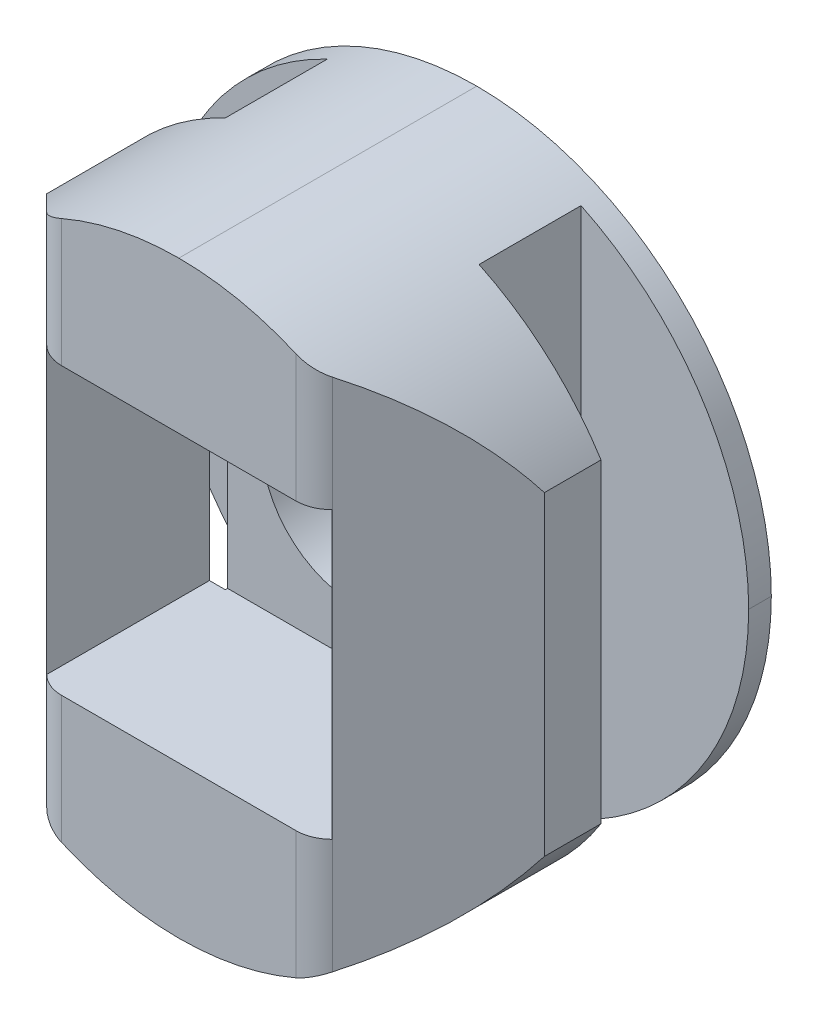
ISO-10303-21;
HEADER;
FILE_DESCRIPTION(('STEP AP214'),'2;1');
FILE_NAME('part.step','',(''),(''),'','','');
FILE_SCHEMA(('AUTOMOTIVE_DESIGN { 1 0 10303 214 1 1 1 1 }'));
ENDSEC;
DATA;
#1=APPLICATION_CONTEXT('core data for automotive mechanical design processes');
#2=APPLICATION_PROTOCOL_DEFINITION('international standard','automotive_design',2000,#1);
#3=PRODUCT_CONTEXT('',#1,'mechanical');
#4=PRODUCT('Part','Part','',(#3));
#5=PRODUCT_RELATED_PRODUCT_CATEGORY('part','',(#4));
#6=PRODUCT_DEFINITION_FORMATION('','',#4);
#7=PRODUCT_DEFINITION_CONTEXT('part definition',#1,'design');
#8=PRODUCT_DEFINITION('design','',#6,#7);
#9=PRODUCT_DEFINITION_SHAPE('','',#8);
#10=(LENGTH_UNIT() NAMED_UNIT(*) SI_UNIT(.MILLI.,.METRE.));
#11=(NAMED_UNIT(*) PLANE_ANGLE_UNIT() SI_UNIT($,.RADIAN.));
#12=(NAMED_UNIT(*) SI_UNIT($,.STERADIAN.) SOLID_ANGLE_UNIT());
#13=UNCERTAINTY_MEASURE_WITH_UNIT(LENGTH_MEASURE(1.E-05),#10,'distance_accuracy_value','');
#14=(GEOMETRIC_REPRESENTATION_CONTEXT(3) GLOBAL_UNCERTAINTY_ASSIGNED_CONTEXT((#13)) GLOBAL_UNIT_ASSIGNED_CONTEXT((#10,
#11,#12)) REPRESENTATION_CONTEXT('',''));
#15=CARTESIAN_POINT('',(0.,0.,0.));
#16=DIRECTION('',(0.,0.,1.));
#17=DIRECTION('',(1.,0.,0.));
#18=AXIS2_PLACEMENT_3D('',#15,#16,#17);
#19=CARTESIAN_POINT('',(2.5857864376269,6.5,-4.075));
#20=DIRECTION('',(0.,0.,-1.));
#21=DIRECTION('',(-1.,0.,0.));
#22=AXIS2_PLACEMENT_3D('',#19,#20,#21);
#23=PLANE('',#22);
#24=DIRECTION('',(0.,-1.,0.));
#25=VECTOR('',#24,1.);
#26=CARTESIAN_POINT('',(-2.58578643762691,6.5,-4.075));
#27=LINE('',#26,#25);
#28=CARTESIAN_POINT('',(-2.58578643762691,5.96353154590338,-4.075));
#29=VERTEX_POINT('',#28);
#30=CARTESIAN_POINT('',(-2.58578643762691,3.15,-4.075));
#31=VERTEX_POINT('',#30);
#32=EDGE_CURVE('E276',#29,#31,#27,.T.);
#33=ORIENTED_EDGE('',*,*,#32,.T.);
#34=DIRECTION('',(-1.,0.,0.));
#35=VECTOR('',#34,1.);
#36=CARTESIAN_POINT('',(-3.15,3.15,-4.075));
#37=LINE('',#36,#35);
#38=CARTESIAN_POINT('',(2.5857864376269,3.15,-4.075));
#39=VERTEX_POINT('',#38);
#40=EDGE_CURVE('E394',#39,#31,#37,.T.);
#41=ORIENTED_EDGE('',*,*,#40,.F.);
#42=DIRECTION('',(0.,-1.,0.));
#43=VECTOR('',#42,1.);
#44=CARTESIAN_POINT('',(2.5857864376269,6.5,-4.075));
#45=LINE('',#44,#43);
#46=CARTESIAN_POINT('',(2.5857864376269,5.96353154590338,-4.075));
#47=VERTEX_POINT('',#46);
#48=EDGE_CURVE('E272',#47,#39,#45,.T.);
#49=ORIENTED_EDGE('',*,*,#48,.F.);
#50=CARTESIAN_POINT('',(0.,0.,-4.075));
#51=DIRECTION('',(0.,0.,-1.));
#52=DIRECTION('',(-1.,0.,0.));
#53=AXIS2_PLACEMENT_3D('',#50,#51,#52);
#54=CIRCLE('',#53,6.5);
#55=CARTESIAN_POINT('',(0.,6.5,-4.075));
#56=VERTEX_POINT('',#55);
#57=EDGE_CURVE('E307',#47,#56,#54,.F.);
#58=ORIENTED_EDGE('',*,*,#57,.T.);
#59=CARTESIAN_POINT('',(0.,0.,-4.075));
#60=DIRECTION('',(0.,0.,-1.));
#61=DIRECTION('',(-1.,0.,0.));
#62=AXIS2_PLACEMENT_3D('',#59,#60,#61);
#63=CIRCLE('',#62,6.5);
#64=EDGE_CURVE('E305',#56,#29,#63,.F.);
#65=ORIENTED_EDGE('',*,*,#64,.T.);
#66=EDGE_LOOP('',(#33,#41,#49,#58,#65));
#67=FACE_BOUND('',#66,.T.);
#68=ADVANCED_FACE('F41',(#67),#23,.F.);
#69=CARTESIAN_POINT('',(0.,0.,-4.075));
#70=DIRECTION('',(0.,0.,-1.));
#71=DIRECTION('',(-1.,0.,0.));
#72=AXIS2_PLACEMENT_3D('',#69,#70,#71);
#73=CYLINDRICAL_SURFACE('',#72,2.05);
#74=CARTESIAN_POINT('',(0.,0.,-7.95));
#75=DIRECTION('',(0.,0.,-1.));
#76=DIRECTION('',(-1.,0.,0.));
#77=AXIS2_PLACEMENT_3D('',#74,#75,#76);
#78=CIRCLE('',#77,2.05);
#79=CARTESIAN_POINT('',(-2.05,0.,-7.95));
#80=VERTEX_POINT('',#79);
#81=EDGE_CURVE('E243',#80,#80,#78,.F.);
#82=ORIENTED_EDGE('',*,*,#81,.T.);
#83=EDGE_LOOP('',(#82));
#84=FACE_BOUND('',#83,.T.);
#85=CARTESIAN_POINT('',(0.,0.,-10.45));
#86=DIRECTION('',(0.,0.,-1.));
#87=DIRECTION('',(-1.,0.,0.));
#88=AXIS2_PLACEMENT_3D('',#85,#86,#87);
#89=CIRCLE('',#88,2.05);
#90=CARTESIAN_POINT('',(-2.05,0.,-10.45));
#91=VERTEX_POINT('',#90);
#92=EDGE_CURVE('E250',#91,#91,#89,.F.);
#93=ORIENTED_EDGE('',*,*,#92,.F.);
#94=EDGE_LOOP('',(#93));
#95=FACE_BOUND('',#94,.T.);
#96=ADVANCED_FACE('F382',(#84,#95),#73,.F.);
#97=CARTESIAN_POINT('',(-6.5,6.5,-10.65));
#98=DIRECTION('',(0.,0.,1.));
#99=DIRECTION('',(1.,0.,0.));
#100=AXIS2_PLACEMENT_3D('',#97,#98,#99);
#101=PLANE('',#100);
#102=CARTESIAN_POINT('',(0.,0.,-10.65));
#103=DIRECTION('',(0.,0.,-1.));
#104=DIRECTION('',(-1.,0.,0.));
#105=AXIS2_PLACEMENT_3D('',#102,#103,#104);
#106=CIRCLE('',#105,3.05);
#107=CARTESIAN_POINT('',(-3.05,0.,-10.65));
#108=VERTEX_POINT('',#107);
#109=EDGE_CURVE('E251',#108,#108,#106,.T.);
#110=ORIENTED_EDGE('',*,*,#109,.F.);
#111=EDGE_LOOP('',(#110));
#112=FACE_BOUND('',#111,.T.);
#113=CARTESIAN_POINT('',(0.,0.,-10.65));
#114=DIRECTION('',(0.,0.,1.));
#115=DIRECTION('',(1.,0.,0.));
#116=AXIS2_PLACEMENT_3D('',#113,#114,#115);
#117=CIRCLE('',#116,6.5);
#118=CARTESIAN_POINT('',(0.,6.5,-10.65));
#119=VERTEX_POINT('',#118);
#120=CARTESIAN_POINT('',(6.5,0.,-10.65));
#121=VERTEX_POINT('',#120);
#122=EDGE_CURVE('E298',#119,#121,#117,.F.);
#123=ORIENTED_EDGE('',*,*,#122,.T.);
#124=CARTESIAN_POINT('',(0.,0.,-10.65));
#125=DIRECTION('',(0.,0.,1.));
#126=DIRECTION('',(1.,0.,0.));
#127=AXIS2_PLACEMENT_3D('',#124,#125,#126);
#128=CIRCLE('',#127,6.5);
#129=CARTESIAN_POINT('',(0.,-6.5,-10.65));
#130=VERTEX_POINT('',#129);
#131=EDGE_CURVE('E302',#121,#130,#128,.F.);
#132=ORIENTED_EDGE('',*,*,#131,.T.);
#133=CARTESIAN_POINT('',(0.,0.,-10.65));
#134=DIRECTION('',(0.,0.,1.));
#135=DIRECTION('',(1.,0.,0.));
#136=AXIS2_PLACEMENT_3D('',#133,#134,#135);
#137=CIRCLE('',#136,6.5);
#138=CARTESIAN_POINT('',(-6.5,0.,-10.65));
#139=VERTEX_POINT('',#138);
#140=EDGE_CURVE('E300',#130,#139,#137,.F.);
#141=ORIENTED_EDGE('',*,*,#140,.T.);
#142=CARTESIAN_POINT('',(0.,0.,-10.65));
#143=DIRECTION('',(0.,0.,1.));
#144=DIRECTION('',(1.,0.,0.));
#145=AXIS2_PLACEMENT_3D('',#142,#143,#144);
#146=CIRCLE('',#145,6.5);
#147=EDGE_CURVE('E294',#139,#119,#146,.F.);
#148=ORIENTED_EDGE('',*,*,#147,.T.);
#149=EDGE_LOOP('',(#123,#132,#141,#148));
#150=FACE_BOUND('',#149,.T.);
#151=ADVANCED_FACE('F388',(#112,#150),#101,.F.);
#152=CARTESIAN_POINT('',(-2.80000000000001,6.5,-10.15));
#153=DIRECTION('',(0.,0.,-1.));
#154=DIRECTION('',(-1.,0.,0.));
#155=AXIS2_PLACEMENT_3D('',#152,#153,#154);
#156=PLANE('',#155);
#157=CARTESIAN_POINT('',(0.,0.,-10.15));
#158=DIRECTION('',(0.,0.,-1.));
#159=DIRECTION('',(-1.,0.,0.));
#160=AXIS2_PLACEMENT_3D('',#157,#158,#159);
#161=CIRCLE('',#160,6.5);
#162=CARTESIAN_POINT('',(-2.80000000000001,5.86600375042498,-10.15));
#163=VERTEX_POINT('',#162);
#164=CARTESIAN_POINT('',(-6.5,0.,-10.15));
#165=VERTEX_POINT('',#164);
#166=EDGE_CURVE('E425',#163,#165,#161,.F.);
#167=ORIENTED_EDGE('',*,*,#166,.T.);
#168=CARTESIAN_POINT('',(0.,0.,-10.15));
#169=DIRECTION('',(0.,0.,-1.));
#170=DIRECTION('',(-1.,0.,0.));
#171=AXIS2_PLACEMENT_3D('',#168,#169,#170);
#172=CIRCLE('',#171,6.5);
#173=CARTESIAN_POINT('',(-2.80000000000001,-5.86600375042498,-10.15));
#174=VERTEX_POINT('',#173);
#175=EDGE_CURVE('E423',#165,#174,#172,.F.);
#176=ORIENTED_EDGE('',*,*,#175,.T.);
#177=DIRECTION('',(0.,-1.,0.));
#178=VECTOR('',#177,1.);
#179=CARTESIAN_POINT('',(-2.80000000000001,6.5,-10.15));
#180=LINE('',#179,#178);
#181=EDGE_CURVE('E291',#163,#174,#180,.T.);
#182=ORIENTED_EDGE('',*,*,#181,.F.);
#183=EDGE_LOOP('',(#167,#176,#182));
#184=FACE_BOUND('',#183,.T.);
#185=ADVANCED_FACE('F552',(#184),#156,.F.);
#186=CARTESIAN_POINT('',(-2.80000000000001,6.5,-7.9));
#187=DIRECTION('',(1.,0.,0.));
#188=DIRECTION('',(0.,0.,-1.));
#189=AXIS2_PLACEMENT_3D('',#186,#187,#188);
#190=PLANE('',#189);
#191=DIRECTION('',(0.,1.,0.));
#192=VECTOR('',#191,1.);
#193=CARTESIAN_POINT('',(-2.80000000000001,6.5,-7.95));
#194=LINE('',#193,#192);
#195=CARTESIAN_POINT('',(-2.80000000000001,-3.15,-7.95));
#196=VERTEX_POINT('',#195);
#197=CARTESIAN_POINT('',(-2.80000000000001,3.15,-7.95));
#198=VERTEX_POINT('',#197);
#199=EDGE_CURVE('E488',#196,#198,#194,.T.);
#200=ORIENTED_EDGE('',*,*,#199,.T.);
#201=DIRECTION('',(0.,0.,1.));
#202=VECTOR('',#201,1.);
#203=CARTESIAN_POINT('',(-2.80000000000001,3.15,-7.9));
#204=LINE('',#203,#202);
#205=CARTESIAN_POINT('',(-2.80000000000001,3.15,-7.9));
#206=VERTEX_POINT('',#205);
#207=EDGE_CURVE('E485',#198,#206,#204,.T.);
#208=ORIENTED_EDGE('',*,*,#207,.T.);
#209=DIRECTION('',(0.,-1.,0.));
#210=VECTOR('',#209,1.);
#211=CARTESIAN_POINT('',(-2.80000000000001,6.5,-7.9));
#212=LINE('',#211,#210);
#213=CARTESIAN_POINT('',(-2.80000000000001,5.86600375042498,-7.9));
#214=VERTEX_POINT('',#213);
#215=EDGE_CURVE('E289',#214,#206,#212,.T.);
#216=ORIENTED_EDGE('',*,*,#215,.F.);
#217=DIRECTION('',(0.,0.,-1.));
#218=VECTOR('',#217,1.);
#219=CARTESIAN_POINT('',(-2.80000000000001,5.86600375042498,-7.9));
#220=LINE('',#219,#218);
#221=EDGE_CURVE('E421',#214,#163,#220,.T.);
#222=ORIENTED_EDGE('',*,*,#221,.T.);
#223=ORIENTED_EDGE('',*,*,#181,.T.);
#224=DIRECTION('',(0.,0.,1.));
#225=VECTOR('',#224,1.);
#226=CARTESIAN_POINT('',(-2.80000000000001,-5.86600375042498,-10.15));
#227=LINE('',#226,#225);
#228=CARTESIAN_POINT('',(-2.80000000000001,-5.86600375042498,-7.9));
#229=VERTEX_POINT('',#228);
#230=EDGE_CURVE('E418',#174,#229,#227,.T.);
#231=ORIENTED_EDGE('',*,*,#230,.T.);
#232=CARTESIAN_POINT('',(-2.80000000000001,-3.15,-7.9));
#233=VERTEX_POINT('',#232);
#234=EDGE_CURVE('E288',#233,#229,#212,.T.);
#235=ORIENTED_EDGE('',*,*,#234,.F.);
#236=DIRECTION('',(0.,0.,-1.));
#237=VECTOR('',#236,1.);
#238=CARTESIAN_POINT('',(-2.80000000000001,-3.15,-7.9));
#239=LINE('',#238,#237);
#240=EDGE_CURVE('E57',#233,#196,#239,.T.);
#241=ORIENTED_EDGE('',*,*,#240,.T.);
#242=EDGE_LOOP('',(#200,#208,#216,#222,#223,#231,#235,#241));
#243=FACE_BOUND('',#242,.T.);
#244=ADVANCED_FACE('F556',(#243),#190,.F.);
#245=CARTESIAN_POINT('',(-5.49215728752538,6.5,-7.89999999999999));
#246=DIRECTION('',(0.,0.,1.));
#247=DIRECTION('',(1.,0.,0.));
#248=AXIS2_PLACEMENT_3D('',#245,#246,#247);
#249=PLANE('',#248);
#250=ORIENTED_EDGE('',*,*,#215,.T.);
#251=DIRECTION('',(-1.,0.,0.));
#252=VECTOR('',#251,1.);
#253=CARTESIAN_POINT('',(-5.49215728752538,3.15,-7.89999999999999));
#254=LINE('',#253,#252);
#255=CARTESIAN_POINT('',(-3.15,3.15,-7.9));
#256=VERTEX_POINT('',#255);
#257=EDGE_CURVE('E235',#206,#256,#254,.T.);
#258=ORIENTED_EDGE('',*,*,#257,.T.);
#259=DIRECTION('',(0.,-1.,0.));
#260=VECTOR('',#259,1.);
#261=CARTESIAN_POINT('',(-3.15,6.5,-7.9));
#262=LINE('',#261,#260);
#263=CARTESIAN_POINT('',(-3.15,-3.15,-7.9));
#264=VERTEX_POINT('',#263);
#265=EDGE_CURVE('E227',#256,#264,#262,.T.);
#266=ORIENTED_EDGE('',*,*,#265,.T.);
#267=DIRECTION('',(1.,0.,0.));
#268=VECTOR('',#267,1.);
#269=CARTESIAN_POINT('',(-5.49215728752538,-3.15,-7.89999999999999));
#270=LINE('',#269,#268);
#271=EDGE_CURVE('E214',#264,#233,#270,.T.);
#272=ORIENTED_EDGE('',*,*,#271,.T.);
#273=ORIENTED_EDGE('',*,*,#234,.T.);
#274=CARTESIAN_POINT('',(0.,0.,-7.9));
#275=DIRECTION('',(0.,0.,1.));
#276=DIRECTION('',(1.,0.,0.));
#277=AXIS2_PLACEMENT_3D('',#274,#275,#276);
#278=CIRCLE('',#277,6.5);
#279=CARTESIAN_POINT('',(-5.49215728752538,-3.47652244765971,-7.89999999999999));
#280=VERTEX_POINT('',#279);
#281=EDGE_CURVE('E414',#229,#280,#278,.F.);
#282=ORIENTED_EDGE('',*,*,#281,.T.);
#283=DIRECTION('',(0.,-1.,0.));
#284=VECTOR('',#283,1.);
#285=CARTESIAN_POINT('',(-5.49215728752538,6.5,-7.89999999999999));
#286=LINE('',#285,#284);
#287=CARTESIAN_POINT('',(-5.49215728752538,3.47652244765972,-7.89999999999999));
#288=VERTEX_POINT('',#287);
#289=EDGE_CURVE('E285',#288,#280,#286,.T.);
#290=ORIENTED_EDGE('',*,*,#289,.F.);
#291=CARTESIAN_POINT('',(0.,0.,-7.9));
#292=DIRECTION('',(0.,0.,1.));
#293=DIRECTION('',(1.,0.,0.));
#294=AXIS2_PLACEMENT_3D('',#291,#292,#293);
#295=CIRCLE('',#294,6.5);
#296=EDGE_CURVE('E416',#288,#214,#295,.F.);
#297=ORIENTED_EDGE('',*,*,#296,.T.);
#298=EDGE_LOOP('',(#250,#258,#266,#272,#273,#282,#290,#297));
#299=FACE_BOUND('',#298,.T.);
#300=ADVANCED_FACE('F234',(#299),#249,.F.);
#301=CARTESIAN_POINT('',(-5.49215728752538,6.5,-6.64999999999999));
#302=DIRECTION('',(1.,0.,0.));
#303=DIRECTION('',(0.,0.,-1.));
#304=AXIS2_PLACEMENT_3D('',#301,#302,#303);
#305=PLANE('',#304);
#306=ORIENTED_EDGE('',*,*,#289,.T.);
#307=DIRECTION('',(0.,0.,1.));
#308=VECTOR('',#307,1.);
#309=CARTESIAN_POINT('',(-5.49215728752538,-3.47652244765971,-7.89999999999999));
#310=LINE('',#309,#308);
#311=CARTESIAN_POINT('',(-5.49215728752538,-3.47652244765971,-6.64999999999999));
#312=VERTEX_POINT('',#311);
#313=EDGE_CURVE('E408',#280,#312,#310,.T.);
#314=ORIENTED_EDGE('',*,*,#313,.T.);
#315=DIRECTION('',(0.,-1.,0.));
#316=VECTOR('',#315,1.);
#317=CARTESIAN_POINT('',(-5.49215728752538,6.5,-6.64999999999999));
#318=LINE('',#317,#316);
#319=CARTESIAN_POINT('',(-5.49215728752538,3.47652244765972,-6.64999999999999));
#320=VERTEX_POINT('',#319);
#321=EDGE_CURVE('E282',#320,#312,#318,.T.);
#322=ORIENTED_EDGE('',*,*,#321,.F.);
#323=DIRECTION('',(0.,0.,-1.));
#324=VECTOR('',#323,1.);
#325=CARTESIAN_POINT('',(-5.49215728752538,3.47652244765971,-6.64999999999999));
#326=LINE('',#325,#324);
#327=EDGE_CURVE('E412',#320,#288,#326,.T.);
#328=ORIENTED_EDGE('',*,*,#327,.T.);
#329=EDGE_LOOP('',(#306,#314,#322,#328));
#330=FACE_BOUND('',#329,.T.);
#331=ADVANCED_FACE('F539',(#330),#305,.F.);
#332=CARTESIAN_POINT('',(-3.15147186257615,6.5,-4.30931457505076));
#333=DIRECTION('',(0.707106781186547,0.,-0.707106781186548));
#334=DIRECTION('',(-0.707106781186548,0.,-0.707106781186547));
#335=AXIS2_PLACEMENT_3D('',#332,#333,#334);
#336=PLANE('',#335);
#337=ORIENTED_EDGE('',*,*,#321,.T.);
#338=CARTESIAN_POINT('',(0.,0.,-1.15784271247462));
#339=DIRECTION('',(0.707106781186547,0.,-0.707106781186548));
#340=DIRECTION('',(0.707106781186548,0.,0.707106781186547));
#341=AXIS2_PLACEMENT_3D('',#338,#339,#340);
#342=ELLIPSE('',#341,9.19238815542511,6.5);
#343=CARTESIAN_POINT('',(-3.15147186257615,-5.68491205731371,-4.30931457505076));
#344=VERTEX_POINT('',#343);
#345=EDGE_CURVE('E405',#312,#344,#342,.F.);
#346=ORIENTED_EDGE('',*,*,#345,.T.);
#347=DIRECTION('',(0.,-1.,0.));
#348=VECTOR('',#347,1.);
#349=CARTESIAN_POINT('',(-3.15147186257615,6.5,-4.30931457505076));
#350=LINE('',#349,#348);
#351=CARTESIAN_POINT('',(-3.15147186257615,5.68491205731371,-4.30931457505076));
#352=VERTEX_POINT('',#351);
#353=EDGE_CURVE('E279',#352,#344,#350,.T.);
#354=ORIENTED_EDGE('',*,*,#353,.F.);
#355=CARTESIAN_POINT('',(0.,0.,-1.15784271247462));
#356=DIRECTION('',(0.707106781186547,0.,-0.707106781186548));
#357=DIRECTION('',(-0.707106781186548,0.,-0.707106781186547));
#358=AXIS2_PLACEMENT_3D('',#355,#356,#357);
#359=ELLIPSE('',#358,9.19238815542511,6.5);
#360=EDGE_CURVE('E404',#352,#320,#359,.F.);
#361=ORIENTED_EDGE('',*,*,#360,.T.);
#362=EDGE_LOOP('',(#337,#346,#354,#361));
#363=FACE_BOUND('',#362,.T.);
#364=ADVANCED_FACE('F348',(#363),#336,.F.);
#365=CARTESIAN_POINT('',(-2.58578643762691,6.5,-4.875));
#366=DIRECTION('',(0.,-1.,0.));
#367=DIRECTION('',(0.,0.,-1.));
#368=AXIS2_PLACEMENT_3D('',#365,#366,#367);
#369=CYLINDRICAL_SURFACE('',#368,0.8);
#370=DIRECTION('',(0.,-1.,0.));
#371=VECTOR('',#370,1.);
#372=CARTESIAN_POINT('',(-3.15,6.5,-4.30784653220291));
#373=LINE('',#372,#371);
#374=CARTESIAN_POINT('',(-3.15,-3.15,-4.30784653220291));
#375=VERTEX_POINT('',#374);
#376=CARTESIAN_POINT('',(-3.15,3.15,-4.30784653220291));
#377=VERTEX_POINT('',#376);
#378=EDGE_CURVE('E12',#375,#377,#373,.F.);
#379=ORIENTED_EDGE('',*,*,#378,.T.);
#380=CARTESIAN_POINT('',(-2.58578643762691,3.15,-4.875));
#381=DIRECTION('',(0.,1.,0.));
#382=DIRECTION('',(0.,0.,1.));
#383=AXIS2_PLACEMENT_3D('',#380,#381,#382);
#384=CIRCLE('',#383,0.8);
#385=EDGE_CURVE('E399',#377,#31,#384,.T.);
#386=ORIENTED_EDGE('',*,*,#385,.T.);
#387=ORIENTED_EDGE('',*,*,#32,.F.);
#388=CARTESIAN_POINT('',(-2.58578643762691,5.96353154590338,-4.075));
#389=CARTESIAN_POINT('',(-2.63533527101851,5.94207471367576,-4.07498880583561));
#390=CARTESIAN_POINT('',(-2.68456846326641,5.919967270859,-4.07960004245977));
#391=CARTESIAN_POINT('',(-2.7813112413249,5.87512316713422,-4.09770053386896));
#392=CARTESIAN_POINT('',(-2.82881377500557,5.85238448059539,-4.11122257751276));
#393=CARTESIAN_POINT('',(-2.92062438851359,5.80711640119468,-4.14677483867063));
#394=CARTESIAN_POINT('',(-2.96493197546117,5.7845870410903,-4.16880636561212));
#395=CARTESIAN_POINT('',(-3.04901434968485,5.74070903837528,-4.22089695729342));
#396=CARTESIAN_POINT('',(-3.0888054338621,5.71935630368999,-4.25092576108768));
#397=CARTESIAN_POINT('',(-3.13446009148253,5.6943185132186,-4.29267807071479));
#398=CARTESIAN_POINT('',(-3.14305216024699,5.68958005476144,-4.30089380904779));
#399=CARTESIAN_POINT('',(-3.15147186257615,5.68491205731371,-4.30931457505076));
#400=B_SPLINE_CURVE_WITH_KNOTS('',3,(#388,#389,#390,#391,#392,#393,#394,#395,#396,#397,#398,
#399),.UNSPECIFIED.,.F.,.F.,(4,2,2,2,2,4),(0.,0.161748110882256,0.324094750484342,
0.486466381720109,0.648232134725071,0.686612536185628),.UNSPECIFIED.);
#401=EDGE_CURVE('E353',#29,#352,#400,.T.);
#402=ORIENTED_EDGE('',*,*,#401,.T.);
#403=ORIENTED_EDGE('',*,*,#353,.T.);
#404=CARTESIAN_POINT('',(-3.15147186257615,-5.68491205731371,-4.30931457505076));
#405=CARTESIAN_POINT('',(-3.11657886450842,-5.70427441645689,-4.27442079918931));
#406=CARTESIAN_POINT('',(-3.07882822127217,-5.72476451401733,-4.24312259104262));
#407=CARTESIAN_POINT('',(-2.99873748630904,-5.76711065516029,-4.18809881233583));
#408=CARTESIAN_POINT('',(-2.95639125823358,-5.78896850817021,-4.16438353790649));
#409=CARTESIAN_POINT('',(-2.86837968289277,-5.83308137326484,-4.12502333456168));
#410=CARTESIAN_POINT('',(-2.82271767566528,-5.85533596910735,-4.10937040952644));
#411=CARTESIAN_POINT('',(-2.72926483263532,-5.89947114696722,-4.08650972515557));
#412=CARTESIAN_POINT('',(-2.68147990647202,-5.92135255816356,-4.07927988102404));
#413=CARTESIAN_POINT('',(-2.61747816050069,-5.94971564667948,-4.07547049247882));
#414=CARTESIAN_POINT('',(-2.60164306890803,-5.95665753355954,-4.07499835667047));
#415=CARTESIAN_POINT('',(-2.58578643762691,-5.96353154590338,-4.075));
#416=B_SPLINE_CURVE_WITH_KNOTS('',3,(#404,#405,#406,#407,#408,#409,#410,#411,#412,#413,#414,
#415),.UNSPECIFIED.,.F.,.F.,(4,2,2,2,2,4),(0.,0.158719936536567,0.317654477239978,
0.476431084000373,0.63479044471872,0.686651933355521),.UNSPECIFIED.);
#417=CARTESIAN_POINT('',(-2.58578643762691,-5.96353154590338,-4.075));
#418=VERTEX_POINT('',#417);
#419=EDGE_CURVE('E360',#344,#418,#416,.T.);
#420=ORIENTED_EDGE('',*,*,#419,.T.);
#421=CARTESIAN_POINT('',(-2.58578643762691,-3.15,-4.075));
#422=VERTEX_POINT('',#421);
#423=EDGE_CURVE('E275',#422,#418,#27,.T.);
#424=ORIENTED_EDGE('',*,*,#423,.F.);
#425=CARTESIAN_POINT('',(-2.58578643762691,-3.15,-4.875));
#426=DIRECTION('',(0.,-1.,0.));
#427=DIRECTION('',(0.,0.,-1.));
#428=AXIS2_PLACEMENT_3D('',#425,#426,#427);
#429=CIRCLE('',#428,0.8);
#430=EDGE_CURVE('E222',#422,#375,#429,.T.);
#431=ORIENTED_EDGE('',*,*,#430,.T.);
#432=EDGE_LOOP('',(#379,#386,#387,#402,#403,#420,#424,#431));
#433=FACE_BOUND('',#432,.T.);
#434=ADVANCED_FACE('F343',(#433),#369,.T.);
#435=CARTESIAN_POINT('',(2.5857864376269,-3.15,-4.075));
#436=VERTEX_POINT('',#435);
#437=CARTESIAN_POINT('',(2.5857864376269,-5.96353154590338,-4.075));
#438=VERTEX_POINT('',#437);
#439=EDGE_CURVE('E271',#436,#438,#45,.T.);
#440=ORIENTED_EDGE('',*,*,#439,.F.);
#441=DIRECTION('',(1.,0.,0.));
#442=VECTOR('',#441,1.);
#443=CARTESIAN_POINT('',(-3.15,-3.15,-4.075));
#444=LINE('',#443,#442);
#445=EDGE_CURVE('E731',#422,#436,#444,.T.);
#446=ORIENTED_EDGE('',*,*,#445,.F.);
#447=ORIENTED_EDGE('',*,*,#423,.T.);
#448=CARTESIAN_POINT('',(0.,0.,-4.075));
#449=DIRECTION('',(0.,0.,-1.));
#450=DIRECTION('',(-1.,0.,0.));
#451=AXIS2_PLACEMENT_3D('',#448,#449,#450);
#452=CIRCLE('',#451,6.5);
#453=CARTESIAN_POINT('',(0.,-6.5,-4.075));
#454=VERTEX_POINT('',#453);
#455=EDGE_CURVE('E309',#418,#454,#452,.F.);
#456=ORIENTED_EDGE('',*,*,#455,.T.);
#457=CARTESIAN_POINT('',(0.,0.,-4.075));
#458=DIRECTION('',(0.,0.,-1.));
#459=DIRECTION('',(-1.,0.,0.));
#460=AXIS2_PLACEMENT_3D('',#457,#458,#459);
#461=CIRCLE('',#460,6.5);
#462=EDGE_CURVE('E311',#454,#438,#461,.F.);
#463=ORIENTED_EDGE('',*,*,#462,.T.);
#464=EDGE_LOOP('',(#440,#446,#447,#456,#463));
#465=FACE_BOUND('',#464,.T.);
#466=ADVANCED_FACE('F337',(#465),#23,.F.);
#467=CARTESIAN_POINT('',(2.5857864376269,6.5,-4.875));
#468=DIRECTION('',(0.,-1.,0.));
#469=DIRECTION('',(0.,0.,-1.));
#470=AXIS2_PLACEMENT_3D('',#467,#468,#469);
#471=CYLINDRICAL_SURFACE('',#470,0.8);
#472=ORIENTED_EDGE('',*,*,#48,.T.);
#473=CARTESIAN_POINT('',(2.5857864376269,3.15,-4.875));
#474=DIRECTION('',(0.,1.,0.));
#475=DIRECTION('',(0.,0.,1.));
#476=AXIS2_PLACEMENT_3D('',#473,#474,#475);
#477=CIRCLE('',#476,0.8);
#478=CARTESIAN_POINT('',(3.15,3.15,-4.30784653220291));
#479=VERTEX_POINT('',#478);
#480=EDGE_CURVE('E475',#39,#479,#477,.T.);
#481=ORIENTED_EDGE('',*,*,#480,.T.);
#482=DIRECTION('',(0.,-1.,0.));
#483=VECTOR('',#482,1.);
#484=CARTESIAN_POINT('',(3.15,6.5,-4.30784653220291));
#485=LINE('',#484,#483);
#486=CARTESIAN_POINT('',(3.15,-3.15,-4.30784653220291));
#487=VERTEX_POINT('',#486);
#488=EDGE_CURVE('E237',#479,#487,#485,.T.);
#489=ORIENTED_EDGE('',*,*,#488,.T.);
#490=CARTESIAN_POINT('',(2.5857864376269,-3.15,-4.875));
#491=DIRECTION('',(0.,-1.,0.));
#492=DIRECTION('',(0.,0.,-1.));
#493=AXIS2_PLACEMENT_3D('',#490,#491,#492);
#494=CIRCLE('',#493,0.8);
#495=EDGE_CURVE('E727',#487,#436,#494,.T.);
#496=ORIENTED_EDGE('',*,*,#495,.T.);
#497=ORIENTED_EDGE('',*,*,#439,.T.);
#498=CARTESIAN_POINT('',(2.5857864376269,-5.96353154590338,-4.075));
#499=CARTESIAN_POINT('',(2.6353352710185,-5.94207471367576,-4.07498880583561));
#500=CARTESIAN_POINT('',(2.68456846326641,-5.919967270859,-4.07960004245977));
#501=CARTESIAN_POINT('',(2.78131124132489,-5.87512316713422,-4.09770053386896));
#502=CARTESIAN_POINT('',(2.82881377500557,-5.85238448059539,-4.11122257751276));
#503=CARTESIAN_POINT('',(2.92062438851358,-5.80711640119468,-4.14677483867063));
#504=CARTESIAN_POINT('',(2.96493197546116,-5.7845870410903,-4.16880636561212));
#505=CARTESIAN_POINT('',(3.04901434968485,-5.74070903837528,-4.22089695729342));
#506=CARTESIAN_POINT('',(3.08880543386209,-5.71935630368999,-4.25092576108768));
#507=CARTESIAN_POINT('',(3.13446009148252,-5.6943185132186,-4.29267807071479));
#508=CARTESIAN_POINT('',(3.14305216024699,-5.68958005476144,-4.30089380904779));
#509=CARTESIAN_POINT('',(3.15147186257615,-5.68491205731371,-4.30931457505076));
#510=B_SPLINE_CURVE_WITH_KNOTS('',3,(#498,#499,#500,#501,#502,#503,#504,#505,#506,#507,#508,
#509),.UNSPECIFIED.,.F.,.F.,(4,2,2,2,2,4),(0.,0.161748110882256,0.324094750484343,
0.48646638172011,0.648232134725072,0.686612536185632),.UNSPECIFIED.);
#511=CARTESIAN_POINT('',(3.15147186257615,-5.68491205731371,-4.30931457505076));
#512=VERTEX_POINT('',#511);
#513=EDGE_CURVE('E322',#438,#512,#510,.T.);
#514=ORIENTED_EDGE('',*,*,#513,.T.);
#515=DIRECTION('',(0.,-1.,0.));
#516=VECTOR('',#515,1.);
#517=CARTESIAN_POINT('',(3.15147186257615,6.5,-4.30931457505076));
#518=LINE('',#517,#516);
#519=CARTESIAN_POINT('',(3.15147186257615,5.68491205731371,-4.30931457505076));
#520=VERTEX_POINT('',#519);
#521=EDGE_CURVE('E268',#520,#512,#518,.T.);
#522=ORIENTED_EDGE('',*,*,#521,.F.);
#523=CARTESIAN_POINT('',(3.15147186257615,5.68491205731371,-4.30931457505076));
#524=CARTESIAN_POINT('',(3.11657886450842,5.70427441645689,-4.27442079918931));
#525=CARTESIAN_POINT('',(3.07882822127216,5.72476451401732,-4.24312259104262));
#526=CARTESIAN_POINT('',(2.99873748630904,5.76711065516029,-4.18809881233583));
#527=CARTESIAN_POINT('',(2.95639125823357,5.78896850817021,-4.16438353790649));
#528=CARTESIAN_POINT('',(2.86837968289276,5.83308137326483,-4.12502333456168));
#529=CARTESIAN_POINT('',(2.82271767566527,5.85533596910734,-4.10937040952644));
#530=CARTESIAN_POINT('',(2.72926483263531,5.89947114696722,-4.08650972515557));
#531=CARTESIAN_POINT('',(2.68147990647201,5.92135255816356,-4.07927988102404));
#532=CARTESIAN_POINT('',(2.61747816050068,5.94971564667948,-4.07547049247883));
#533=CARTESIAN_POINT('',(2.60164306890802,5.95665753355954,-4.07499835667047));
#534=CARTESIAN_POINT('',(2.5857864376269,5.96353154590338,-4.075));
#535=B_SPLINE_CURVE_WITH_KNOTS('',3,(#523,#524,#525,#526,#527,#528,#529,#530,#531,#532,#533,
#534),.UNSPECIFIED.,.F.,.F.,(4,2,2,2,2,4),(0.,0.158719936536567,0.317654477239978,
0.476431084000374,0.634790444718721,0.686651933355526),.UNSPECIFIED.);
#536=EDGE_CURVE('E314',#520,#47,#535,.T.);
#537=ORIENTED_EDGE('',*,*,#536,.T.);
#538=EDGE_LOOP('',(#472,#481,#489,#496,#497,#514,#522,#537));
#539=FACE_BOUND('',#538,.T.);
#540=ADVANCED_FACE('F331',(#539),#471,.T.);
#541=CARTESIAN_POINT('',(5.49215728752537,6.5,-6.65));
#542=DIRECTION('',(-0.707106781186548,0.,-0.707106781186547));
#543=DIRECTION('',(-0.707106781186547,0.,0.707106781186548));
#544=AXIS2_PLACEMENT_3D('',#541,#542,#543);
#545=PLANE('',#544);
#546=ORIENTED_EDGE('',*,*,#521,.T.);
#547=CARTESIAN_POINT('',(0.,0.,-1.15784271247461));
#548=DIRECTION('',(-0.707106781186548,0.,-0.707106781186547));
#549=DIRECTION('',(0.707106781186547,0.,-0.707106781186548));
#550=AXIS2_PLACEMENT_3D('',#547,#548,#549);
#551=ELLIPSE('',#550,9.19238815542512,6.5);
#552=CARTESIAN_POINT('',(5.49215728752537,-3.47652244765971,-6.65));
#553=VERTEX_POINT('',#552);
#554=EDGE_CURVE('E444',#512,#553,#551,.F.);
#555=ORIENTED_EDGE('',*,*,#554,.T.);
#556=DIRECTION('',(0.,-1.,0.));
#557=VECTOR('',#556,1.);
#558=CARTESIAN_POINT('',(5.49215728752537,6.5,-6.65));
#559=LINE('',#558,#557);
#560=CARTESIAN_POINT('',(5.49215728752537,3.47652244765972,-6.65));
#561=VERTEX_POINT('',#560);
#562=EDGE_CURVE('E265',#561,#553,#559,.T.);
#563=ORIENTED_EDGE('',*,*,#562,.F.);
#564=CARTESIAN_POINT('',(0.,0.,-1.15784271247461));
#565=DIRECTION('',(-0.707106781186548,0.,-0.707106781186547));
#566=DIRECTION('',(-0.707106781186547,0.,0.707106781186548));
#567=AXIS2_PLACEMENT_3D('',#564,#565,#566);
#568=ELLIPSE('',#567,9.19238815542512,6.5);
#569=EDGE_CURVE('E445',#561,#520,#568,.F.);
#570=ORIENTED_EDGE('',*,*,#569,.T.);
#571=EDGE_LOOP('',(#546,#555,#563,#570));
#572=FACE_BOUND('',#571,.T.);
#573=ADVANCED_FACE('F336',(#572),#545,.F.);
#574=CARTESIAN_POINT('',(5.49215728752537,6.5,-7.89999999999999));
#575=DIRECTION('',(-1.,0.,0.));
#576=DIRECTION('',(0.,0.,1.));
#577=AXIS2_PLACEMENT_3D('',#574,#575,#576);
#578=PLANE('',#577);
#579=ORIENTED_EDGE('',*,*,#562,.T.);
#580=DIRECTION('',(0.,0.,-1.));
#581=VECTOR('',#580,1.);
#582=CARTESIAN_POINT('',(5.49215728752537,-3.47652244765972,-6.65));
#583=LINE('',#582,#581);
#584=CARTESIAN_POINT('',(5.49215728752537,-3.47652244765972,-7.89999999999999));
#585=VERTEX_POINT('',#584);
#586=EDGE_CURVE('E440',#553,#585,#583,.T.);
#587=ORIENTED_EDGE('',*,*,#586,.T.);
#588=DIRECTION('',(0.,-1.,0.));
#589=VECTOR('',#588,1.);
#590=CARTESIAN_POINT('',(5.49215728752537,6.5,-7.89999999999999));
#591=LINE('',#590,#589);
#592=CARTESIAN_POINT('',(5.49215728752537,3.47652244765972,-7.89999999999999));
#593=VERTEX_POINT('',#592);
#594=EDGE_CURVE('E262',#593,#585,#591,.T.);
#595=ORIENTED_EDGE('',*,*,#594,.F.);
#596=DIRECTION('',(0.,0.,1.));
#597=VECTOR('',#596,1.);
#598=CARTESIAN_POINT('',(5.49215728752537,3.47652244765972,-7.89999999999999));
#599=LINE('',#598,#597);
#600=EDGE_CURVE('E442',#593,#561,#599,.T.);
#601=ORIENTED_EDGE('',*,*,#600,.T.);
#602=EDGE_LOOP('',(#579,#587,#595,#601));
#603=FACE_BOUND('',#602,.T.);
#604=ADVANCED_FACE('F462',(#603),#578,.F.);
#605=CARTESIAN_POINT('',(2.8,6.5,-7.9));
#606=DIRECTION('',(0.,0.,1.));
#607=DIRECTION('',(1.,0.,0.));
#608=AXIS2_PLACEMENT_3D('',#605,#606,#607);
#609=PLANE('',#608);
#610=DIRECTION('',(0.,1.,0.));
#611=VECTOR('',#610,1.);
#612=CARTESIAN_POINT('',(3.15,6.5,-7.9));
#613=LINE('',#612,#611);
#614=CARTESIAN_POINT('',(3.15,-3.15,-7.9));
#615=VERTEX_POINT('',#614);
#616=CARTESIAN_POINT('',(3.15,3.15,-7.9));
#617=VERTEX_POINT('',#616);
#618=EDGE_CURVE('E50',#615,#617,#613,.T.);
#619=ORIENTED_EDGE('',*,*,#618,.T.);
#620=DIRECTION('',(-1.,0.,0.));
#621=VECTOR('',#620,1.);
#622=CARTESIAN_POINT('',(2.8,3.15,-7.9));
#623=LINE('',#622,#621);
#624=CARTESIAN_POINT('',(2.80000000000001,3.15,-7.9));
#625=VERTEX_POINT('',#624);
#626=EDGE_CURVE('E478',#617,#625,#623,.T.);
#627=ORIENTED_EDGE('',*,*,#626,.T.);
#628=DIRECTION('',(0.,-1.,0.));
#629=VECTOR('',#628,1.);
#630=CARTESIAN_POINT('',(2.8,6.5,-7.9));
#631=LINE('',#630,#629);
#632=CARTESIAN_POINT('',(2.8,5.86600375042498,-7.9));
#633=VERTEX_POINT('',#632);
#634=EDGE_CURVE('E259',#633,#625,#631,.T.);
#635=ORIENTED_EDGE('',*,*,#634,.F.);
#636=CARTESIAN_POINT('',(0.,0.,-7.9));
#637=DIRECTION('',(0.,0.,1.));
#638=DIRECTION('',(1.,0.,0.));
#639=AXIS2_PLACEMENT_3D('',#636,#637,#638);
#640=CIRCLE('',#639,6.5);
#641=EDGE_CURVE('E438',#633,#593,#640,.F.);
#642=ORIENTED_EDGE('',*,*,#641,.T.);
#643=ORIENTED_EDGE('',*,*,#594,.T.);
#644=CARTESIAN_POINT('',(0.,0.,-7.9));
#645=DIRECTION('',(0.,0.,1.));
#646=DIRECTION('',(1.,0.,0.));
#647=AXIS2_PLACEMENT_3D('',#644,#645,#646);
#648=CIRCLE('',#647,6.5);
#649=CARTESIAN_POINT('',(2.8,-5.86600375042498,-7.9));
#650=VERTEX_POINT('',#649);
#651=EDGE_CURVE('E435',#585,#650,#648,.F.);
#652=ORIENTED_EDGE('',*,*,#651,.T.);
#653=CARTESIAN_POINT('',(2.8,-3.15,-7.9));
#654=VERTEX_POINT('',#653);
#655=EDGE_CURVE('E258',#654,#650,#631,.T.);
#656=ORIENTED_EDGE('',*,*,#655,.F.);
#657=DIRECTION('',(1.,0.,0.));
#658=VECTOR('',#657,1.);
#659=CARTESIAN_POINT('',(2.8,-3.15,-7.9));
#660=LINE('',#659,#658);
#661=EDGE_CURVE('E724',#654,#615,#660,.T.);
#662=ORIENTED_EDGE('',*,*,#661,.T.);
#663=EDGE_LOOP('',(#619,#627,#635,#642,#643,#652,#656,#662));
#664=FACE_BOUND('',#663,.T.);
#665=ADVANCED_FACE('F466',(#664),#609,.F.);
#666=CARTESIAN_POINT('',(2.8,6.5,-10.15));
#667=DIRECTION('',(-1.,0.,0.));
#668=DIRECTION('',(0.,0.,1.));
#669=AXIS2_PLACEMENT_3D('',#666,#667,#668);
#670=PLANE('',#669);
#671=ORIENTED_EDGE('',*,*,#634,.T.);
#672=DIRECTION('',(0.,0.,-1.));
#673=VECTOR('',#672,1.);
#674=CARTESIAN_POINT('',(2.8,3.15,-10.15));
#675=LINE('',#674,#673);
#676=CARTESIAN_POINT('',(2.80000000000001,3.15,-7.95));
#677=VERTEX_POINT('',#676);
#678=EDGE_CURVE('E734',#625,#677,#675,.T.);
#679=ORIENTED_EDGE('',*,*,#678,.T.);
#680=DIRECTION('',(0.,-1.,0.));
#681=VECTOR('',#680,1.);
#682=CARTESIAN_POINT('',(2.80000000000001,6.5,-7.95));
#683=LINE('',#682,#681);
#684=CARTESIAN_POINT('',(2.80000000000001,-3.15,-7.95));
#685=VERTEX_POINT('',#684);
#686=EDGE_CURVE('E735',#677,#685,#683,.T.);
#687=ORIENTED_EDGE('',*,*,#686,.T.);
#688=DIRECTION('',(0.,0.,1.));
#689=VECTOR('',#688,1.);
#690=CARTESIAN_POINT('',(2.8,-3.15,-10.15));
#691=LINE('',#690,#689);
#692=EDGE_CURVE('E366',#685,#654,#691,.T.);
#693=ORIENTED_EDGE('',*,*,#692,.T.);
#694=ORIENTED_EDGE('',*,*,#655,.T.);
#695=DIRECTION('',(0.,0.,-1.));
#696=VECTOR('',#695,1.);
#697=CARTESIAN_POINT('',(2.8,-5.86600375042498,-7.9));
#698=LINE('',#697,#696);
#699=CARTESIAN_POINT('',(2.8,-5.86600375042498,-10.15));
#700=VERTEX_POINT('',#699);
#701=EDGE_CURVE('E431',#650,#700,#698,.T.);
#702=ORIENTED_EDGE('',*,*,#701,.T.);
#703=DIRECTION('',(0.,-1.,0.));
#704=VECTOR('',#703,1.);
#705=CARTESIAN_POINT('',(2.8,6.5,-10.15));
#706=LINE('',#705,#704);
#707=CARTESIAN_POINT('',(2.8,5.86600375042498,-10.15));
#708=VERTEX_POINT('',#707);
#709=EDGE_CURVE('E255',#708,#700,#706,.T.);
#710=ORIENTED_EDGE('',*,*,#709,.F.);
#711=DIRECTION('',(0.,0.,1.));
#712=VECTOR('',#711,1.);
#713=CARTESIAN_POINT('',(2.8,5.86600375042498,-10.15));
#714=LINE('',#713,#712);
#715=EDGE_CURVE('E433',#708,#633,#714,.T.);
#716=ORIENTED_EDGE('',*,*,#715,.T.);
#717=EDGE_LOOP('',(#671,#679,#687,#693,#694,#702,#710,#716));
#718=FACE_BOUND('',#717,.T.);
#719=ADVANCED_FACE('F519',(#718),#670,.F.);
#720=CARTESIAN_POINT('',(6.5,6.5,-10.15));
#721=DIRECTION('',(0.,0.,-1.));
#722=DIRECTION('',(-1.,0.,0.));
#723=AXIS2_PLACEMENT_3D('',#720,#721,#722);
#724=PLANE('',#723);
#725=ORIENTED_EDGE('',*,*,#709,.T.);
#726=CARTESIAN_POINT('',(0.,0.,-10.15));
#727=DIRECTION('',(0.,0.,-1.));
#728=DIRECTION('',(-1.,0.,0.));
#729=AXIS2_PLACEMENT_3D('',#726,#727,#728);
#730=CIRCLE('',#729,6.5);
#731=CARTESIAN_POINT('',(6.5,0.,-10.15));
#732=VERTEX_POINT('',#731);
#733=EDGE_CURVE('E427',#700,#732,#730,.F.);
#734=ORIENTED_EDGE('',*,*,#733,.T.);
#735=CARTESIAN_POINT('',(0.,0.,-10.15));
#736=DIRECTION('',(0.,0.,-1.));
#737=DIRECTION('',(-1.,0.,0.));
#738=AXIS2_PLACEMENT_3D('',#735,#736,#737);
#739=CIRCLE('',#738,6.5);
#740=EDGE_CURVE('E429',#732,#708,#739,.F.);
#741=ORIENTED_EDGE('',*,*,#740,.T.);
#742=EDGE_LOOP('',(#725,#734,#741));
#743=FACE_BOUND('',#742,.T.);
#744=ADVANCED_FACE('F512',(#743),#724,.F.);
#745=CARTESIAN_POINT('',(0.,0.,-10.45));
#746=DIRECTION('',(0.,0.,-1.));
#747=DIRECTION('',(-1.,0.,0.));
#748=AXIS2_PLACEMENT_3D('',#745,#746,#747);
#749=PLANE('',#748);
#750=CARTESIAN_POINT('',(0.,0.,-10.45));
#751=DIRECTION('',(0.,0.,-1.));
#752=DIRECTION('',(-1.,0.,0.));
#753=AXIS2_PLACEMENT_3D('',#750,#751,#752);
#754=CIRCLE('',#753,3.05);
#755=CARTESIAN_POINT('',(-3.05,0.,-10.45));
#756=VERTEX_POINT('',#755);
#757=EDGE_CURVE('E247',#756,#756,#754,.T.);
#758=ORIENTED_EDGE('',*,*,#757,.T.);
#759=EDGE_LOOP('',(#758));
#760=FACE_BOUND('',#759,.T.);
#761=ORIENTED_EDGE('',*,*,#92,.T.);
#762=EDGE_LOOP('',(#761));
#763=FACE_BOUND('',#762,.T.);
#764=ADVANCED_FACE('F509',(#760,#763),#749,.T.);
#765=CARTESIAN_POINT('',(0.,0.,-10.45));
#766=DIRECTION('',(0.,0.,-1.));
#767=DIRECTION('',(-1.,0.,0.));
#768=AXIS2_PLACEMENT_3D('',#765,#766,#767);
#769=CYLINDRICAL_SURFACE('',#768,3.05);
#770=ORIENTED_EDGE('',*,*,#757,.F.);
#771=EDGE_LOOP('',(#770));
#772=FACE_BOUND('',#771,.T.);
#773=ORIENTED_EDGE('',*,*,#109,.T.);
#774=EDGE_LOOP('',(#773));
#775=FACE_BOUND('',#774,.T.);
#776=ADVANCED_FACE('F378',(#772,#775),#769,.F.);
#777=CARTESIAN_POINT('',(0.,0.,-4.875));
#778=DIRECTION('',(0.,0.,-1.));
#779=DIRECTION('',(-1.,0.,0.));
#780=AXIS2_PLACEMENT_3D('',#777,#778,#779);
#781=CYLINDRICAL_SURFACE('',#780,6.5);
#782=DIRECTION('',(0.,0.,1.));
#783=VECTOR('',#782,1.);
#784=CARTESIAN_POINT('',(0.,6.5,-10.15));
#785=LINE('',#784,#783);
#786=EDGE_CURVE('E741',#119,#56,#785,.T.);
#787=ORIENTED_EDGE('',*,*,#786,.F.);
#788=ORIENTED_EDGE('',*,*,#147,.F.);
#789=DIRECTION('',(0.,0.,1.));
#790=VECTOR('',#789,1.);
#791=CARTESIAN_POINT('',(-6.5,0.,-10.65));
#792=LINE('',#791,#790);
#793=EDGE_CURVE('E254',#165,#139,#792,.F.);
#794=ORIENTED_EDGE('',*,*,#793,.F.);
#795=ORIENTED_EDGE('',*,*,#166,.F.);
#796=ORIENTED_EDGE('',*,*,#221,.F.);
#797=ORIENTED_EDGE('',*,*,#296,.F.);
#798=ORIENTED_EDGE('',*,*,#327,.F.);
#799=ORIENTED_EDGE('',*,*,#360,.F.);
#800=ORIENTED_EDGE('',*,*,#401,.F.);
#801=ORIENTED_EDGE('',*,*,#64,.F.);
#802=EDGE_LOOP('',(#787,#788,#794,#795,#796,#797,#798,#799,#800,#801));
#803=FACE_BOUND('',#802,.T.);
#804=ADVANCED_FACE('F43',(#803),#781,.T.);
#805=CARTESIAN_POINT('',(0.,0.,-10.15));
#806=DIRECTION('',(0.,0.,1.));
#807=DIRECTION('',(1.,0.,0.));
#808=AXIS2_PLACEMENT_3D('',#805,#806,#807);
#809=CYLINDRICAL_SURFACE('',#808,6.5);
#810=ORIENTED_EDGE('',*,*,#793,.T.);
#811=ORIENTED_EDGE('',*,*,#140,.F.);
#812=DIRECTION('',(0.,0.,1.));
#813=VECTOR('',#812,1.);
#814=CARTESIAN_POINT('',(0.,-6.5,-4.875));
#815=LINE('',#814,#813);
#816=EDGE_CURVE('E240',#454,#130,#815,.F.);
#817=ORIENTED_EDGE('',*,*,#816,.F.);
#818=ORIENTED_EDGE('',*,*,#455,.F.);
#819=ORIENTED_EDGE('',*,*,#419,.F.);
#820=ORIENTED_EDGE('',*,*,#345,.F.);
#821=ORIENTED_EDGE('',*,*,#313,.F.);
#822=ORIENTED_EDGE('',*,*,#281,.F.);
#823=ORIENTED_EDGE('',*,*,#230,.F.);
#824=ORIENTED_EDGE('',*,*,#175,.F.);
#825=EDGE_LOOP('',(#810,#811,#817,#818,#819,#820,#821,#822,#823,#824));
#826=FACE_BOUND('',#825,.T.);
#827=ADVANCED_FACE('F368',(#826),#809,.T.);
#828=CARTESIAN_POINT('',(0.,0.,-4.875));
#829=DIRECTION('',(0.,0.,1.));
#830=DIRECTION('',(1.,0.,0.));
#831=AXIS2_PLACEMENT_3D('',#828,#829,#830);
#832=CYLINDRICAL_SURFACE('',#831,6.5);
#833=ORIENTED_EDGE('',*,*,#715,.F.);
#834=ORIENTED_EDGE('',*,*,#740,.F.);
#835=DIRECTION('',(0.,0.,-1.));
#836=VECTOR('',#835,1.);
#837=CARTESIAN_POINT('',(6.5,0.,-10.15));
#838=LINE('',#837,#836);
#839=EDGE_CURVE('E236',#121,#732,#838,.F.);
#840=ORIENTED_EDGE('',*,*,#839,.F.);
#841=ORIENTED_EDGE('',*,*,#122,.F.);
#842=ORIENTED_EDGE('',*,*,#786,.T.);
#843=ORIENTED_EDGE('',*,*,#57,.F.);
#844=ORIENTED_EDGE('',*,*,#536,.F.);
#845=ORIENTED_EDGE('',*,*,#569,.F.);
#846=ORIENTED_EDGE('',*,*,#600,.F.);
#847=ORIENTED_EDGE('',*,*,#641,.F.);
#848=EDGE_LOOP('',(#833,#834,#840,#841,#842,#843,#844,#845,#846,#847));
#849=FACE_BOUND('',#848,.T.);
#850=ADVANCED_FACE('F329',(#849),#832,.T.);
#851=CARTESIAN_POINT('',(0.,0.,-10.65));
#852=DIRECTION('',(0.,0.,-1.));
#853=DIRECTION('',(-1.,0.,0.));
#854=AXIS2_PLACEMENT_3D('',#851,#852,#853);
#855=CYLINDRICAL_SURFACE('',#854,6.5);
#856=ORIENTED_EDGE('',*,*,#462,.F.);
#857=ORIENTED_EDGE('',*,*,#816,.T.);
#858=ORIENTED_EDGE('',*,*,#131,.F.);
#859=ORIENTED_EDGE('',*,*,#839,.T.);
#860=ORIENTED_EDGE('',*,*,#733,.F.);
#861=ORIENTED_EDGE('',*,*,#701,.F.);
#862=ORIENTED_EDGE('',*,*,#651,.F.);
#863=ORIENTED_EDGE('',*,*,#586,.F.);
#864=ORIENTED_EDGE('',*,*,#554,.F.);
#865=ORIENTED_EDGE('',*,*,#513,.F.);
#866=EDGE_LOOP('',(#856,#857,#858,#859,#860,#861,#862,#863,#864,#865));
#867=FACE_BOUND('',#866,.T.);
#868=ADVANCED_FACE('F376',(#867),#855,.T.);
#869=CARTESIAN_POINT('',(-3.15,-3.15,-19.3595454429505));
#870=DIRECTION('',(-1.,0.,0.));
#871=DIRECTION('',(0.,0.,1.));
#872=AXIS2_PLACEMENT_3D('',#869,#870,#871);
#873=PLANE('',#872);
#874=DIRECTION('',(0.,0.,1.));
#875=VECTOR('',#874,1.);
#876=CARTESIAN_POINT('',(-3.15,3.15,-19.3595454429505));
#877=LINE('',#876,#875);
#878=EDGE_CURVE('E230',#256,#377,#877,.T.);
#879=ORIENTED_EDGE('',*,*,#878,.T.);
#880=ORIENTED_EDGE('',*,*,#378,.F.);
#881=DIRECTION('',(0.,0.,1.));
#882=VECTOR('',#881,1.);
#883=CARTESIAN_POINT('',(-3.15,-3.15,-19.3595454429505));
#884=LINE('',#883,#882);
#885=EDGE_CURVE('E217',#264,#375,#884,.T.);
#886=ORIENTED_EDGE('',*,*,#885,.F.);
#887=ORIENTED_EDGE('',*,*,#265,.F.);
#888=EDGE_LOOP('',(#879,#880,#886,#887));
#889=FACE_BOUND('',#888,.T.);
#890=ADVANCED_FACE('F226',(#889),#873,.F.);
#891=CARTESIAN_POINT('',(3.15,-3.15,-19.3595454429505));
#892=DIRECTION('',(1.,0.,0.));
#893=DIRECTION('',(0.,0.,-1.));
#894=AXIS2_PLACEMENT_3D('',#891,#892,#893);
#895=PLANE('',#894);
#896=DIRECTION('',(0.,0.,1.));
#897=VECTOR('',#896,1.);
#898=CARTESIAN_POINT('',(3.15,3.15,-19.3595454429505));
#899=LINE('',#898,#897);
#900=EDGE_CURVE('E717',#617,#479,#899,.T.);
#901=ORIENTED_EDGE('',*,*,#900,.F.);
#902=ORIENTED_EDGE('',*,*,#618,.F.);
#903=DIRECTION('',(0.,0.,1.));
#904=VECTOR('',#903,1.);
#905=CARTESIAN_POINT('',(3.15,-3.15,-19.3595454429505));
#906=LINE('',#905,#904);
#907=EDGE_CURVE('E65',#615,#487,#906,.T.);
#908=ORIENTED_EDGE('',*,*,#907,.T.);
#909=ORIENTED_EDGE('',*,*,#488,.F.);
#910=EDGE_LOOP('',(#901,#902,#908,#909));
#911=FACE_BOUND('',#910,.T.);
#912=ADVANCED_FACE('F497',(#911),#895,.F.);
#913=CARTESIAN_POINT('',(0.,0.,-7.95));
#914=DIRECTION('',(0.,0.,-1.));
#915=DIRECTION('',(-1.,0.,0.));
#916=AXIS2_PLACEMENT_3D('',#913,#914,#915);
#917=PLANE('',#916);
#918=DIRECTION('',(1.,0.,0.));
#919=VECTOR('',#918,1.);
#920=CARTESIAN_POINT('',(-3.15,-3.15,-7.95));
#921=LINE('',#920,#919);
#922=EDGE_CURVE('E229',#196,#685,#921,.T.);
#923=ORIENTED_EDGE('',*,*,#922,.T.);
#924=ORIENTED_EDGE('',*,*,#686,.F.);
#925=DIRECTION('',(-1.,0.,0.));
#926=VECTOR('',#925,1.);
#927=CARTESIAN_POINT('',(-3.15,3.15,-7.95));
#928=LINE('',#927,#926);
#929=EDGE_CURVE('E714',#677,#198,#928,.T.);
#930=ORIENTED_EDGE('',*,*,#929,.T.);
#931=ORIENTED_EDGE('',*,*,#199,.F.);
#932=EDGE_LOOP('',(#923,#924,#930,#931));
#933=FACE_BOUND('',#932,.T.);
#934=ORIENTED_EDGE('',*,*,#81,.F.);
#935=EDGE_LOOP('',(#934));
#936=FACE_BOUND('',#935,.T.);
#937=ADVANCED_FACE('F494',(#933,#936),#917,.F.);
#938=CARTESIAN_POINT('',(-3.15,3.15,-19.3595454429505));
#939=DIRECTION('',(0.,1.,0.));
#940=DIRECTION('',(0.,0.,1.));
#941=AXIS2_PLACEMENT_3D('',#938,#939,#940);
#942=PLANE('',#941);
#943=ORIENTED_EDGE('',*,*,#929,.F.);
#944=ORIENTED_EDGE('',*,*,#678,.F.);
#945=ORIENTED_EDGE('',*,*,#626,.F.);
#946=ORIENTED_EDGE('',*,*,#900,.T.);
#947=ORIENTED_EDGE('',*,*,#480,.F.);
#948=ORIENTED_EDGE('',*,*,#40,.T.);
#949=ORIENTED_EDGE('',*,*,#385,.F.);
#950=ORIENTED_EDGE('',*,*,#878,.F.);
#951=ORIENTED_EDGE('',*,*,#257,.F.);
#952=ORIENTED_EDGE('',*,*,#207,.F.);
#953=EDGE_LOOP('',(#943,#944,#945,#946,#947,#948,#949,#950,#951,#952));
#954=FACE_BOUND('',#953,.T.);
#955=ADVANCED_FACE('F496',(#954),#942,.F.);
#956=CARTESIAN_POINT('',(-3.15,-3.15,-19.3595454429505));
#957=DIRECTION('',(0.,-1.,0.));
#958=DIRECTION('',(0.,0.,-1.));
#959=AXIS2_PLACEMENT_3D('',#956,#957,#958);
#960=PLANE('',#959);
#961=ORIENTED_EDGE('',*,*,#271,.F.);
#962=ORIENTED_EDGE('',*,*,#885,.T.);
#963=ORIENTED_EDGE('',*,*,#430,.F.);
#964=ORIENTED_EDGE('',*,*,#445,.T.);
#965=ORIENTED_EDGE('',*,*,#495,.F.);
#966=ORIENTED_EDGE('',*,*,#907,.F.);
#967=ORIENTED_EDGE('',*,*,#661,.F.);
#968=ORIENTED_EDGE('',*,*,#692,.F.);
#969=ORIENTED_EDGE('',*,*,#922,.F.);
#970=ORIENTED_EDGE('',*,*,#240,.F.);
#971=EDGE_LOOP('',(#961,#962,#963,#964,#965,#966,#967,#968,#969,#970));
#972=FACE_BOUND('',#971,.T.);
#973=ADVANCED_FACE('F216',(#972),#960,.F.);
#974=CLOSED_SHELL('',(#68,#96,#151,#185,#244,#300,#331,#364,#434,#466,#540,#573,#604,#665,#719,
#744,#764,#776,#804,#827,#850,#868,#890,#912,#937,#955,#973));
#975=MANIFOLD_SOLID_BREP('B2',#974);
#976=ADVANCED_BREP_SHAPE_REPRESENTATION('',(#18,#975),#14);
#977=SHAPE_DEFINITION_REPRESENTATION(#9,#976);
ENDSEC;
END-ISO-10303-21;
